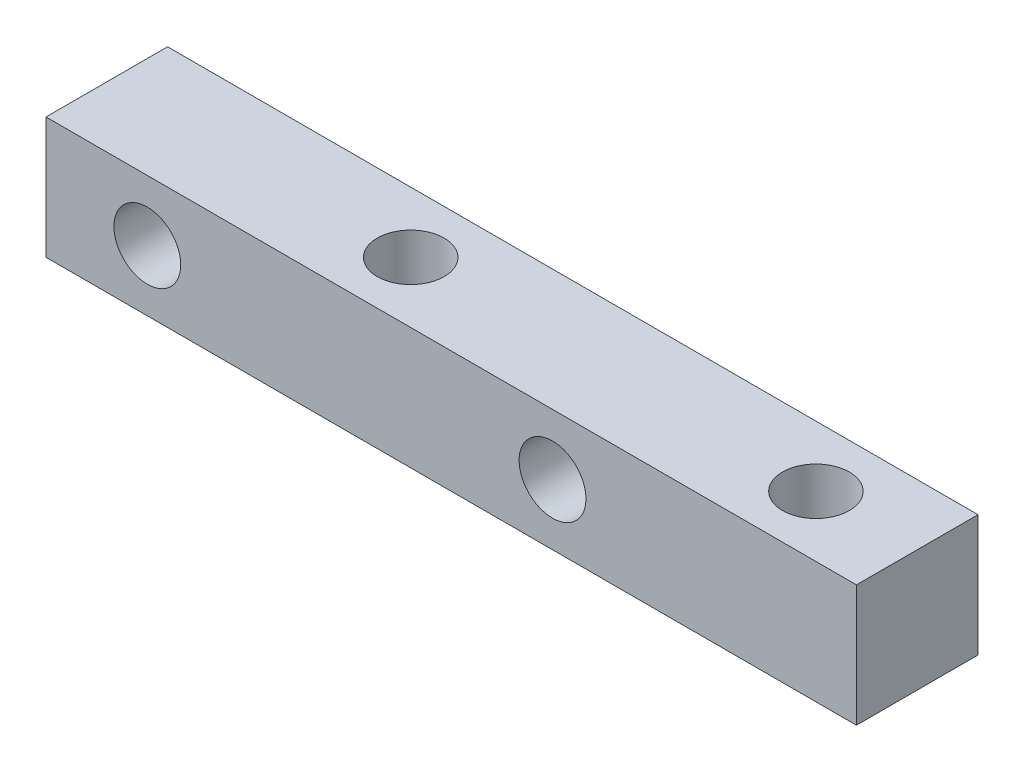
ISO-10303-21;
HEADER;
FILE_DESCRIPTION(('STEP AP214'),'2;1');
FILE_NAME('part.step','',(''),(''),'','','');
FILE_SCHEMA(('AUTOMOTIVE_DESIGN { 1 0 10303 214 1 1 1 1 }'));
ENDSEC;
DATA;
#1=APPLICATION_CONTEXT('core data for automotive mechanical design processes');
#2=APPLICATION_PROTOCOL_DEFINITION('international standard','automotive_design',2000,#1);
#3=PRODUCT_CONTEXT('',#1,'mechanical');
#4=PRODUCT('Part','Part','',(#3));
#5=PRODUCT_RELATED_PRODUCT_CATEGORY('part','',(#4));
#6=PRODUCT_DEFINITION_FORMATION('','',#4);
#7=PRODUCT_DEFINITION_CONTEXT('part definition',#1,'design');
#8=PRODUCT_DEFINITION('design','',#6,#7);
#9=PRODUCT_DEFINITION_SHAPE('','',#8);
#10=(LENGTH_UNIT() NAMED_UNIT(*) SI_UNIT(.MILLI.,.METRE.));
#11=(NAMED_UNIT(*) PLANE_ANGLE_UNIT() SI_UNIT($,.RADIAN.));
#12=(NAMED_UNIT(*) SI_UNIT($,.STERADIAN.) SOLID_ANGLE_UNIT());
#13=UNCERTAINTY_MEASURE_WITH_UNIT(LENGTH_MEASURE(1.E-05),#10,'distance_accuracy_value','');
#14=(GEOMETRIC_REPRESENTATION_CONTEXT(3) GLOBAL_UNCERTAINTY_ASSIGNED_CONTEXT((#13)) GLOBAL_UNIT_ASSIGNED_CONTEXT((#10,
#11,#12)) REPRESENTATION_CONTEXT('',''));
#15=CARTESIAN_POINT('',(0.,0.,0.));
#16=DIRECTION('',(0.,0.,1.));
#17=DIRECTION('',(1.,0.,0.));
#18=AXIS2_PLACEMENT_3D('',#15,#16,#17);
#19=CARTESIAN_POINT('',(40.,-3.,-3.));
#20=DIRECTION('',(0.,0.,1.));
#21=DIRECTION('',(-1.,0.,0.));
#22=AXIS2_PLACEMENT_3D('',#19,#20,#21);
#23=PLANE('',#22);
#24=CARTESIAN_POINT('',(5.,0.,-3.));
#25=DIRECTION('',(0.,0.,1.));
#26=DIRECTION('',(1.,0.,0.));
#27=AXIS2_PLACEMENT_3D('',#24,#25,#26);
#28=CIRCLE('',#27,1.65);
#29=CARTESIAN_POINT('',(6.65,0.,-3.));
#30=VERTEX_POINT('',#29);
#31=EDGE_CURVE('E142',#30,#30,#28,.T.);
#32=ORIENTED_EDGE('',*,*,#31,.T.);
#33=EDGE_LOOP('',(#32));
#34=FACE_BOUND('',#33,.T.);
#35=CARTESIAN_POINT('',(25.,0.,-3.));
#36=DIRECTION('',(0.,0.,1.));
#37=DIRECTION('',(1.,0.,0.));
#38=AXIS2_PLACEMENT_3D('',#35,#36,#37);
#39=CIRCLE('',#38,1.65);
#40=CARTESIAN_POINT('',(26.65,0.,-3.));
#41=VERTEX_POINT('',#40);
#42=EDGE_CURVE('E145',#41,#41,#39,.T.);
#43=ORIENTED_EDGE('',*,*,#42,.T.);
#44=EDGE_LOOP('',(#43));
#45=FACE_BOUND('',#44,.T.);
#46=DIRECTION('',(0.,-1.,0.));
#47=VECTOR('',#46,1.);
#48=CARTESIAN_POINT('',(0.,-3.,-3.));
#49=LINE('',#48,#47);
#50=CARTESIAN_POINT('',(0.,3.,-3.));
#51=VERTEX_POINT('',#50);
#52=CARTESIAN_POINT('',(0.,-3.,-3.));
#53=VERTEX_POINT('',#52);
#54=EDGE_CURVE('E107',#51,#53,#49,.T.);
#55=ORIENTED_EDGE('',*,*,#54,.F.);
#56=DIRECTION('',(-1.,0.,0.));
#57=VECTOR('',#56,1.);
#58=CARTESIAN_POINT('',(40.,3.,-3.));
#59=LINE('',#58,#57);
#60=CARTESIAN_POINT('',(40.,3.,-3.));
#61=VERTEX_POINT('',#60);
#62=EDGE_CURVE('E106',#61,#51,#59,.T.);
#63=ORIENTED_EDGE('',*,*,#62,.F.);
#64=DIRECTION('',(0.,-1.,0.));
#65=VECTOR('',#64,1.);
#66=CARTESIAN_POINT('',(40.,-3.,-3.));
#67=LINE('',#66,#65);
#68=CARTESIAN_POINT('',(40.,-3.,-3.));
#69=VERTEX_POINT('',#68);
#70=EDGE_CURVE('E100',#61,#69,#67,.T.);
#71=ORIENTED_EDGE('',*,*,#70,.T.);
#72=DIRECTION('',(-1.,0.,0.));
#73=VECTOR('',#72,1.);
#74=CARTESIAN_POINT('',(40.,-3.,-3.));
#75=LINE('',#74,#73);
#76=EDGE_CURVE('E11',#69,#53,#75,.T.);
#77=ORIENTED_EDGE('',*,*,#76,.T.);
#78=EDGE_LOOP('',(#55,#63,#71,#77));
#79=FACE_BOUND('',#78,.T.);
#80=ADVANCED_FACE('F43',(#34,#45,#79),#23,.F.);
#81=CARTESIAN_POINT('',(40.,-3.,3.));
#82=DIRECTION('',(0.,1.,0.));
#83=DIRECTION('',(0.,0.,-1.));
#84=AXIS2_PLACEMENT_3D('',#81,#82,#83);
#85=PLANE('',#84);
#86=CARTESIAN_POINT('',(15.,-3.,0.));
#87=DIRECTION('',(0.,-1.,0.));
#88=DIRECTION('',(0.,0.,-1.));
#89=AXIS2_PLACEMENT_3D('',#86,#87,#88);
#90=CIRCLE('',#89,1.65);
#91=CARTESIAN_POINT('',(15.,-3.,-1.65));
#92=VERTEX_POINT('',#91);
#93=EDGE_CURVE('E151',#92,#92,#90,.T.);
#94=ORIENTED_EDGE('',*,*,#93,.F.);
#95=EDGE_LOOP('',(#94));
#96=FACE_BOUND('',#95,.T.);
#97=CARTESIAN_POINT('',(35.,-3.,0.));
#98=DIRECTION('',(0.,-1.,0.));
#99=DIRECTION('',(0.,0.,-1.));
#100=AXIS2_PLACEMENT_3D('',#97,#98,#99);
#101=CIRCLE('',#100,1.65);
#102=CARTESIAN_POINT('',(35.,-3.,-1.65));
#103=VERTEX_POINT('',#102);
#104=EDGE_CURVE('E155',#103,#103,#101,.T.);
#105=ORIENTED_EDGE('',*,*,#104,.F.);
#106=EDGE_LOOP('',(#105));
#107=FACE_BOUND('',#106,.T.);
#108=DIRECTION('',(0.,0.,1.));
#109=VECTOR('',#108,1.);
#110=CARTESIAN_POINT('',(0.,-3.,3.));
#111=LINE('',#110,#109);
#112=CARTESIAN_POINT('',(0.,-3.,3.));
#113=VERTEX_POINT('',#112);
#114=EDGE_CURVE('E109',#53,#113,#111,.T.);
#115=ORIENTED_EDGE('',*,*,#114,.F.);
#116=ORIENTED_EDGE('',*,*,#76,.F.);
#117=DIRECTION('',(0.,0.,1.));
#118=VECTOR('',#117,1.);
#119=CARTESIAN_POINT('',(40.,-3.,3.));
#120=LINE('',#119,#118);
#121=CARTESIAN_POINT('',(40.,-3.,3.));
#122=VERTEX_POINT('',#121);
#123=EDGE_CURVE('E84',#69,#122,#120,.T.);
#124=ORIENTED_EDGE('',*,*,#123,.T.);
#125=DIRECTION('',(-1.,0.,0.));
#126=VECTOR('',#125,1.);
#127=CARTESIAN_POINT('',(40.,-3.,3.));
#128=LINE('',#127,#126);
#129=EDGE_CURVE('E51',#122,#113,#128,.T.);
#130=ORIENTED_EDGE('',*,*,#129,.T.);
#131=EDGE_LOOP('',(#115,#116,#124,#130));
#132=FACE_BOUND('',#131,.T.);
#133=ADVANCED_FACE('F98',(#96,#107,#132),#85,.F.);
#134=CARTESIAN_POINT('',(40.,-3.,3.));
#135=DIRECTION('',(0.,0.,-1.));
#136=DIRECTION('',(1.,0.,0.));
#137=AXIS2_PLACEMENT_3D('',#134,#135,#136);
#138=PLANE('',#137);
#139=CARTESIAN_POINT('',(5.,0.,3.));
#140=DIRECTION('',(0.,0.,1.));
#141=DIRECTION('',(1.,0.,0.));
#142=AXIS2_PLACEMENT_3D('',#139,#140,#141);
#143=CIRCLE('',#142,1.65);
#144=CARTESIAN_POINT('',(6.65,0.,3.));
#145=VERTEX_POINT('',#144);
#146=EDGE_CURVE('E110',#145,#145,#143,.T.);
#147=ORIENTED_EDGE('',*,*,#146,.F.);
#148=EDGE_LOOP('',(#147));
#149=FACE_BOUND('',#148,.T.);
#150=CARTESIAN_POINT('',(25.,0.,3.));
#151=DIRECTION('',(0.,0.,1.));
#152=DIRECTION('',(1.,0.,0.));
#153=AXIS2_PLACEMENT_3D('',#150,#151,#152);
#154=CIRCLE('',#153,1.65);
#155=CARTESIAN_POINT('',(26.65,0.,3.));
#156=VERTEX_POINT('',#155);
#157=EDGE_CURVE('E147',#156,#156,#154,.T.);
#158=ORIENTED_EDGE('',*,*,#157,.F.);
#159=EDGE_LOOP('',(#158));
#160=FACE_BOUND('',#159,.T.);
#161=DIRECTION('',(0.,1.,0.));
#162=VECTOR('',#161,1.);
#163=CARTESIAN_POINT('',(0.,-3.,3.));
#164=LINE('',#163,#162);
#165=CARTESIAN_POINT('',(0.,3.,3.));
#166=VERTEX_POINT('',#165);
#167=EDGE_CURVE('E94',#113,#166,#164,.T.);
#168=ORIENTED_EDGE('',*,*,#167,.F.);
#169=ORIENTED_EDGE('',*,*,#129,.F.);
#170=DIRECTION('',(0.,1.,0.));
#171=VECTOR('',#170,1.);
#172=CARTESIAN_POINT('',(40.,-3.,3.));
#173=LINE('',#172,#171);
#174=CARTESIAN_POINT('',(40.,3.,3.));
#175=VERTEX_POINT('',#174);
#176=EDGE_CURVE('E87',#122,#175,#173,.T.);
#177=ORIENTED_EDGE('',*,*,#176,.T.);
#178=DIRECTION('',(-1.,0.,0.));
#179=VECTOR('',#178,1.);
#180=CARTESIAN_POINT('',(40.,3.,3.));
#181=LINE('',#180,#179);
#182=EDGE_CURVE('E97',#175,#166,#181,.T.);
#183=ORIENTED_EDGE('',*,*,#182,.T.);
#184=EDGE_LOOP('',(#168,#169,#177,#183));
#185=FACE_BOUND('',#184,.T.);
#186=ADVANCED_FACE('F93',(#149,#160,#185),#138,.F.);
#187=CARTESIAN_POINT('',(40.,3.,3.));
#188=DIRECTION('',(0.,-1.,0.));
#189=DIRECTION('',(0.,0.,1.));
#190=AXIS2_PLACEMENT_3D('',#187,#188,#189);
#191=PLANE('',#190);
#192=CARTESIAN_POINT('',(15.,3.,0.));
#193=DIRECTION('',(0.,-1.,0.));
#194=DIRECTION('',(0.,0.,-1.));
#195=AXIS2_PLACEMENT_3D('',#192,#193,#194);
#196=CIRCLE('',#195,1.65);
#197=CARTESIAN_POINT('',(15.,3.,-1.65));
#198=VERTEX_POINT('',#197);
#199=EDGE_CURVE('E161',#198,#198,#196,.T.);
#200=ORIENTED_EDGE('',*,*,#199,.T.);
#201=EDGE_LOOP('',(#200));
#202=FACE_BOUND('',#201,.T.);
#203=CARTESIAN_POINT('',(35.,3.,0.));
#204=DIRECTION('',(0.,-1.,0.));
#205=DIRECTION('',(0.,0.,-1.));
#206=AXIS2_PLACEMENT_3D('',#203,#204,#205);
#207=CIRCLE('',#206,1.65);
#208=CARTESIAN_POINT('',(35.,3.,-1.65));
#209=VERTEX_POINT('',#208);
#210=EDGE_CURVE('E158',#209,#209,#207,.T.);
#211=ORIENTED_EDGE('',*,*,#210,.T.);
#212=EDGE_LOOP('',(#211));
#213=FACE_BOUND('',#212,.T.);
#214=DIRECTION('',(0.,0.,-1.));
#215=VECTOR('',#214,1.);
#216=CARTESIAN_POINT('',(0.,3.,3.));
#217=LINE('',#216,#215);
#218=EDGE_CURVE('E73',#166,#51,#217,.T.);
#219=ORIENTED_EDGE('',*,*,#218,.F.);
#220=ORIENTED_EDGE('',*,*,#182,.F.);
#221=DIRECTION('',(0.,0.,-1.));
#222=VECTOR('',#221,1.);
#223=CARTESIAN_POINT('',(40.,3.,3.));
#224=LINE('',#223,#222);
#225=EDGE_CURVE('E59',#175,#61,#224,.T.);
#226=ORIENTED_EDGE('',*,*,#225,.T.);
#227=ORIENTED_EDGE('',*,*,#62,.T.);
#228=EDGE_LOOP('',(#219,#220,#226,#227));
#229=FACE_BOUND('',#228,.T.);
#230=ADVANCED_FACE('F119',(#202,#213,#229),#191,.F.);
#231=CARTESIAN_POINT('',(40.,0.,0.));
#232=DIRECTION('',(1.,0.,0.));
#233=DIRECTION('',(0.,0.,1.));
#234=AXIS2_PLACEMENT_3D('',#231,#232,#233);
#235=PLANE('',#234);
#236=ORIENTED_EDGE('',*,*,#70,.F.);
#237=ORIENTED_EDGE('',*,*,#225,.F.);
#238=ORIENTED_EDGE('',*,*,#176,.F.);
#239=ORIENTED_EDGE('',*,*,#123,.F.);
#240=EDGE_LOOP('',(#236,#237,#238,#239));
#241=FACE_BOUND('',#240,.T.);
#242=ADVANCED_FACE('F89',(#241),#235,.T.);
#243=CARTESIAN_POINT('',(0.,0.,0.));
#244=DIRECTION('',(1.,0.,0.));
#245=DIRECTION('',(0.,0.,1.));
#246=AXIS2_PLACEMENT_3D('',#243,#244,#245);
#247=PLANE('',#246);
#248=ORIENTED_EDGE('',*,*,#54,.T.);
#249=ORIENTED_EDGE('',*,*,#114,.T.);
#250=ORIENTED_EDGE('',*,*,#167,.T.);
#251=ORIENTED_EDGE('',*,*,#218,.T.);
#252=EDGE_LOOP('',(#248,#249,#250,#251));
#253=FACE_BOUND('',#252,.T.);
#254=ADVANCED_FACE('F115',(#253),#247,.F.);
#255=CARTESIAN_POINT('',(25.,0.,3.));
#256=DIRECTION('',(0.,0.,-1.));
#257=DIRECTION('',(1.,0.,0.));
#258=AXIS2_PLACEMENT_3D('',#255,#256,#257);
#259=CYLINDRICAL_SURFACE('',#258,1.65);
#260=ORIENTED_EDGE('',*,*,#157,.T.);
#261=EDGE_LOOP('',(#260));
#262=FACE_BOUND('',#261,.T.);
#263=ORIENTED_EDGE('',*,*,#42,.F.);
#264=EDGE_LOOP('',(#263));
#265=FACE_BOUND('',#264,.T.);
#266=ADVANCED_FACE('F182',(#262,#265),#259,.F.);
#267=CARTESIAN_POINT('',(5.,0.,3.));
#268=DIRECTION('',(0.,0.,-1.));
#269=DIRECTION('',(1.,0.,0.));
#270=AXIS2_PLACEMENT_3D('',#267,#268,#269);
#271=CYLINDRICAL_SURFACE('',#270,1.65);
#272=ORIENTED_EDGE('',*,*,#146,.T.);
#273=EDGE_LOOP('',(#272));
#274=FACE_BOUND('',#273,.T.);
#275=ORIENTED_EDGE('',*,*,#31,.F.);
#276=EDGE_LOOP('',(#275));
#277=FACE_BOUND('',#276,.T.);
#278=ADVANCED_FACE('F174',(#274,#277),#271,.F.);
#279=CARTESIAN_POINT('',(35.,-3.,0.));
#280=DIRECTION('',(0.,1.,0.));
#281=DIRECTION('',(0.,0.,-1.));
#282=AXIS2_PLACEMENT_3D('',#279,#280,#281);
#283=CYLINDRICAL_SURFACE('',#282,1.65);
#284=ORIENTED_EDGE('',*,*,#104,.T.);
#285=EDGE_LOOP('',(#284));
#286=FACE_BOUND('',#285,.T.);
#287=ORIENTED_EDGE('',*,*,#210,.F.);
#288=EDGE_LOOP('',(#287));
#289=FACE_BOUND('',#288,.T.);
#290=ADVANCED_FACE('F171',(#286,#289),#283,.F.);
#291=CARTESIAN_POINT('',(15.,-3.,0.));
#292=DIRECTION('',(0.,1.,0.));
#293=DIRECTION('',(0.,0.,-1.));
#294=AXIS2_PLACEMENT_3D('',#291,#292,#293);
#295=CYLINDRICAL_SURFACE('',#294,1.65);
#296=ORIENTED_EDGE('',*,*,#93,.T.);
#297=EDGE_LOOP('',(#296));
#298=FACE_BOUND('',#297,.T.);
#299=ORIENTED_EDGE('',*,*,#199,.F.);
#300=EDGE_LOOP('',(#299));
#301=FACE_BOUND('',#300,.T.);
#302=ADVANCED_FACE('F166',(#298,#301),#295,.F.);
#303=CLOSED_SHELL('',(#80,#133,#186,#230,#242,#254,#266,#278,#290,#302));
#304=MANIFOLD_SOLID_BREP('B2',#303);
#305=ADVANCED_BREP_SHAPE_REPRESENTATION('',(#18,#304),#14);
#306=SHAPE_DEFINITION_REPRESENTATION(#9,#305);
ENDSEC;
END-ISO-10303-21;
